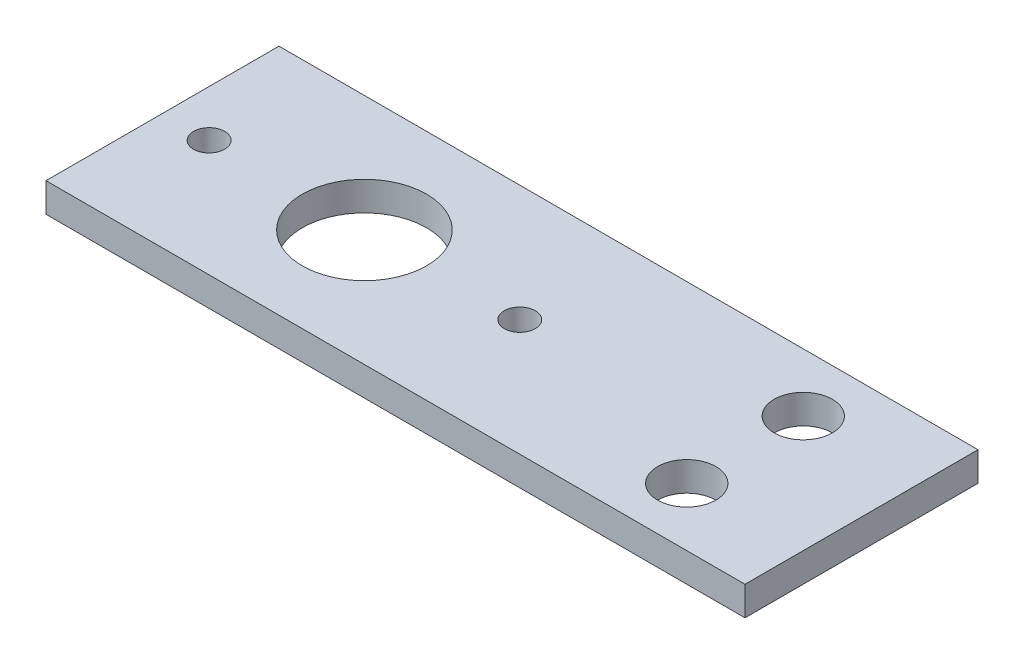
ISO-10303-21;
HEADER;
FILE_DESCRIPTION(('STEP AP214'),'2;1');
FILE_NAME('part.step','',(''),(''),'','','');
FILE_SCHEMA(('AUTOMOTIVE_DESIGN { 1 0 10303 214 1 1 1 1 }'));
ENDSEC;
DATA;
#1=APPLICATION_CONTEXT('core data for automotive mechanical design processes');
#2=APPLICATION_PROTOCOL_DEFINITION('international standard','automotive_design',2000,#1);
#3=PRODUCT_CONTEXT('',#1,'mechanical');
#4=PRODUCT('Part','Part','',(#3));
#5=PRODUCT_RELATED_PRODUCT_CATEGORY('part','',(#4));
#6=PRODUCT_DEFINITION_FORMATION('','',#4);
#7=PRODUCT_DEFINITION_CONTEXT('part definition',#1,'design');
#8=PRODUCT_DEFINITION('design','',#6,#7);
#9=PRODUCT_DEFINITION_SHAPE('','',#8);
#10=(LENGTH_UNIT() NAMED_UNIT(*) SI_UNIT(.MILLI.,.METRE.));
#11=(NAMED_UNIT(*) PLANE_ANGLE_UNIT() SI_UNIT($,.RADIAN.));
#12=(NAMED_UNIT(*) SI_UNIT($,.STERADIAN.) SOLID_ANGLE_UNIT());
#13=UNCERTAINTY_MEASURE_WITH_UNIT(LENGTH_MEASURE(1.E-05),#10,'distance_accuracy_value','');
#14=(GEOMETRIC_REPRESENTATION_CONTEXT(3) GLOBAL_UNCERTAINTY_ASSIGNED_CONTEXT((#13)) GLOBAL_UNIT_ASSIGNED_CONTEXT((#10,
#11,#12)) REPRESENTATION_CONTEXT('',''));
#15=CARTESIAN_POINT('',(0.,0.,0.));
#16=DIRECTION('',(0.,0.,1.));
#17=DIRECTION('',(1.,0.,0.));
#18=AXIS2_PLACEMENT_3D('',#15,#16,#17);
#19=CARTESIAN_POINT('',(0.,4.7625,0.));
#20=DIRECTION('',(0.,-1.,0.));
#21=DIRECTION('',(0.,0.,-1.));
#22=AXIS2_PLACEMENT_3D('',#19,#20,#21);
#23=PLANE('',#22);
#24=DIRECTION('',(0.,0.,1.));
#25=VECTOR('',#24,1.);
#26=CARTESIAN_POINT('',(-114.3,4.7625,19.05));
#27=LINE('',#26,#25);
#28=CARTESIAN_POINT('',(-114.3,4.7625,-19.05));
#29=VERTEX_POINT('',#28);
#30=CARTESIAN_POINT('',(-114.3,4.7625,19.05));
#31=VERTEX_POINT('',#30);
#32=EDGE_CURVE('E98',#29,#31,#27,.T.);
#33=ORIENTED_EDGE('',*,*,#32,.T.);
#34=DIRECTION('',(1.,0.,0.));
#35=VECTOR('',#34,1.);
#36=CARTESIAN_POINT('',(-114.3,4.7625,19.05));
#37=LINE('',#36,#35);
#38=CARTESIAN_POINT('',(0.,4.7625,19.05));
#39=VERTEX_POINT('',#38);
#40=EDGE_CURVE('E93',#31,#39,#37,.T.);
#41=ORIENTED_EDGE('',*,*,#40,.T.);
#42=DIRECTION('',(0.,0.,-1.));
#43=VECTOR('',#42,1.);
#44=CARTESIAN_POINT('',(0.,4.7625,-19.05));
#45=LINE('',#44,#43);
#46=CARTESIAN_POINT('',(0.,4.7625,-19.05));
#47=VERTEX_POINT('',#46);
#48=EDGE_CURVE('E96',#39,#47,#45,.T.);
#49=ORIENTED_EDGE('',*,*,#48,.T.);
#50=DIRECTION('',(-1.,0.,0.));
#51=VECTOR('',#50,1.);
#52=CARTESIAN_POINT('',(-114.3,4.7625,-19.05));
#53=LINE('',#52,#51);
#54=EDGE_CURVE('E63',#47,#29,#53,.T.);
#55=ORIENTED_EDGE('',*,*,#54,.T.);
#56=EDGE_LOOP('',(#33,#41,#49,#55));
#57=FACE_BOUND('',#56,.T.);
#58=CARTESIAN_POINT('',(-106.68,4.7625,0.));
#59=DIRECTION('',(0.,1.,0.));
#60=DIRECTION('',(0.,0.,1.));
#61=AXIS2_PLACEMENT_3D('',#58,#59,#60);
#62=CIRCLE('',#61,2.53999999999998);
#63=CARTESIAN_POINT('',(-106.68,4.7625,-2.53999999999998));
#64=VERTEX_POINT('',#63);
#65=EDGE_CURVE('E120',#64,#64,#62,.T.);
#66=ORIENTED_EDGE('',*,*,#65,.F.);
#67=EDGE_LOOP('',(#66));
#68=FACE_BOUND('',#67,.T.);
#69=CARTESIAN_POINT('',(-81.28,4.7625,0.));
#70=DIRECTION('',(0.,1.,0.));
#71=DIRECTION('',(0.,0.,1.));
#72=AXIS2_PLACEMENT_3D('',#69,#70,#71);
#73=CIRCLE('',#72,10.16);
#74=CARTESIAN_POINT('',(-81.28,4.7625,-10.16));
#75=VERTEX_POINT('',#74);
#76=EDGE_CURVE('E146',#75,#75,#73,.T.);
#77=ORIENTED_EDGE('',*,*,#76,.F.);
#78=EDGE_LOOP('',(#77));
#79=FACE_BOUND('',#78,.T.);
#80=CARTESIAN_POINT('',(-55.88,4.7625,0.));
#81=DIRECTION('',(0.,1.,0.));
#82=DIRECTION('',(0.,0.,1.));
#83=AXIS2_PLACEMENT_3D('',#80,#81,#82);
#84=CIRCLE('',#83,2.53999999999998);
#85=CARTESIAN_POINT('',(-55.88,4.7625,-2.53999999999998));
#86=VERTEX_POINT('',#85);
#87=EDGE_CURVE('E154',#86,#86,#84,.T.);
#88=ORIENTED_EDGE('',*,*,#87,.F.);
#89=EDGE_LOOP('',(#88));
#90=FACE_BOUND('',#89,.T.);
#91=CARTESIAN_POINT('',(-19.05,4.7625,-9.52499999999999));
#92=DIRECTION('',(0.,1.,0.));
#93=DIRECTION('',(0.,0.,1.));
#94=AXIS2_PLACEMENT_3D('',#91,#92,#93);
#95=CIRCLE('',#94,4.76250000000001);
#96=CARTESIAN_POINT('',(-19.05,4.7625,-14.2875));
#97=VERTEX_POINT('',#96);
#98=EDGE_CURVE('E162',#97,#97,#95,.T.);
#99=ORIENTED_EDGE('',*,*,#98,.F.);
#100=EDGE_LOOP('',(#99));
#101=FACE_BOUND('',#100,.T.);
#102=CARTESIAN_POINT('',(-19.05,4.7625,9.52500000000001));
#103=DIRECTION('',(0.,1.,0.));
#104=DIRECTION('',(0.,0.,-1.));
#105=AXIS2_PLACEMENT_3D('',#102,#103,#104);
#106=CIRCLE('',#105,4.76250000000001);
#107=CARTESIAN_POINT('',(-19.05,4.7625,4.7625));
#108=VERTEX_POINT('',#107);
#109=EDGE_CURVE('E170',#108,#108,#106,.T.);
#110=ORIENTED_EDGE('',*,*,#109,.F.);
#111=EDGE_LOOP('',(#110));
#112=FACE_BOUND('',#111,.T.);
#113=ADVANCED_FACE('F45',(#57,#68,#79,#90,#101,#112),#23,.F.);
#114=CARTESIAN_POINT('',(0.,0.,0.));
#115=DIRECTION('',(0.,-1.,0.));
#116=DIRECTION('',(0.,0.,-1.));
#117=AXIS2_PLACEMENT_3D('',#114,#115,#116);
#118=PLANE('',#117);
#119=CARTESIAN_POINT('',(-19.05,0.,-9.52499999999999));
#120=DIRECTION('',(0.,1.,0.));
#121=DIRECTION('',(0.,0.,1.));
#122=AXIS2_PLACEMENT_3D('',#119,#120,#121);
#123=CIRCLE('',#122,4.76250000000001);
#124=CARTESIAN_POINT('',(-19.05,0.,-14.2875));
#125=VERTEX_POINT('',#124);
#126=EDGE_CURVE('E166',#125,#125,#123,.T.);
#127=ORIENTED_EDGE('',*,*,#126,.T.);
#128=EDGE_LOOP('',(#127));
#129=FACE_BOUND('',#128,.T.);
#130=CARTESIAN_POINT('',(-81.28,0.,0.));
#131=DIRECTION('',(0.,1.,0.));
#132=DIRECTION('',(0.,0.,1.));
#133=AXIS2_PLACEMENT_3D('',#130,#131,#132);
#134=CIRCLE('',#133,10.16);
#135=CARTESIAN_POINT('',(-81.28,0.,-10.16));
#136=VERTEX_POINT('',#135);
#137=EDGE_CURVE('E150',#136,#136,#134,.T.);
#138=ORIENTED_EDGE('',*,*,#137,.T.);
#139=EDGE_LOOP('',(#138));
#140=FACE_BOUND('',#139,.T.);
#141=DIRECTION('',(0.,0.,1.));
#142=VECTOR('',#141,1.);
#143=CARTESIAN_POINT('',(-114.3,0.,19.05));
#144=LINE('',#143,#142);
#145=CARTESIAN_POINT('',(-114.3,0.,-19.05));
#146=VERTEX_POINT('',#145);
#147=CARTESIAN_POINT('',(-114.3,0.,19.05));
#148=VERTEX_POINT('',#147);
#149=EDGE_CURVE('E116',#146,#148,#144,.T.);
#150=ORIENTED_EDGE('',*,*,#149,.F.);
#151=DIRECTION('',(-1.,0.,0.));
#152=VECTOR('',#151,1.);
#153=CARTESIAN_POINT('',(-114.3,0.,-19.05));
#154=LINE('',#153,#152);
#155=CARTESIAN_POINT('',(0.,0.,-19.05));
#156=VERTEX_POINT('',#155);
#157=EDGE_CURVE('E86',#156,#146,#154,.T.);
#158=ORIENTED_EDGE('',*,*,#157,.F.);
#159=DIRECTION('',(0.,0.,-1.));
#160=VECTOR('',#159,1.);
#161=CARTESIAN_POINT('',(0.,0.,-19.05));
#162=LINE('',#161,#160);
#163=CARTESIAN_POINT('',(0.,0.,19.05));
#164=VERTEX_POINT('',#163);
#165=EDGE_CURVE('E80',#164,#156,#162,.T.);
#166=ORIENTED_EDGE('',*,*,#165,.F.);
#167=DIRECTION('',(1.,0.,0.));
#168=VECTOR('',#167,1.);
#169=CARTESIAN_POINT('',(-114.3,0.,19.05));
#170=LINE('',#169,#168);
#171=EDGE_CURVE('E103',#148,#164,#170,.T.);
#172=ORIENTED_EDGE('',*,*,#171,.F.);
#173=EDGE_LOOP('',(#150,#158,#166,#172));
#174=FACE_BOUND('',#173,.T.);
#175=CARTESIAN_POINT('',(-106.68,0.,0.));
#176=DIRECTION('',(0.,1.,0.));
#177=DIRECTION('',(0.,0.,1.));
#178=AXIS2_PLACEMENT_3D('',#175,#176,#177);
#179=CIRCLE('',#178,2.53999999999998);
#180=CARTESIAN_POINT('',(-106.68,0.,-2.53999999999998));
#181=VERTEX_POINT('',#180);
#182=EDGE_CURVE('E142',#181,#181,#179,.T.);
#183=ORIENTED_EDGE('',*,*,#182,.T.);
#184=EDGE_LOOP('',(#183));
#185=FACE_BOUND('',#184,.T.);
#186=CARTESIAN_POINT('',(-55.88,0.,0.));
#187=DIRECTION('',(0.,1.,0.));
#188=DIRECTION('',(0.,0.,1.));
#189=AXIS2_PLACEMENT_3D('',#186,#187,#188);
#190=CIRCLE('',#189,2.53999999999998);
#191=CARTESIAN_POINT('',(-55.88,0.,-2.53999999999998));
#192=VERTEX_POINT('',#191);
#193=EDGE_CURVE('E158',#192,#192,#190,.T.);
#194=ORIENTED_EDGE('',*,*,#193,.T.);
#195=EDGE_LOOP('',(#194));
#196=FACE_BOUND('',#195,.T.);
#197=CARTESIAN_POINT('',(-19.05,0.,9.52500000000001));
#198=DIRECTION('',(0.,1.,0.));
#199=DIRECTION('',(0.,0.,-1.));
#200=AXIS2_PLACEMENT_3D('',#197,#198,#199);
#201=CIRCLE('',#200,4.76250000000001);
#202=CARTESIAN_POINT('',(-19.05,0.,4.7625));
#203=VERTEX_POINT('',#202);
#204=EDGE_CURVE('E174',#203,#203,#201,.T.);
#205=ORIENTED_EDGE('',*,*,#204,.T.);
#206=EDGE_LOOP('',(#205));
#207=FACE_BOUND('',#206,.T.);
#208=ADVANCED_FACE('F135',(#129,#140,#174,#185,#196,#207),#118,.T.);
#209=CARTESIAN_POINT('',(-114.3,4.7625,19.05));
#210=DIRECTION('',(1.,0.,0.));
#211=DIRECTION('',(0.,0.,-1.));
#212=AXIS2_PLACEMENT_3D('',#209,#210,#211);
#213=PLANE('',#212);
#214=ORIENTED_EDGE('',*,*,#149,.T.);
#215=DIRECTION('',(0.,-1.,0.));
#216=VECTOR('',#215,1.);
#217=CARTESIAN_POINT('',(-114.3,4.7625,19.05));
#218=LINE('',#217,#216);
#219=EDGE_CURVE('E11',#31,#148,#218,.T.);
#220=ORIENTED_EDGE('',*,*,#219,.F.);
#221=ORIENTED_EDGE('',*,*,#32,.F.);
#222=DIRECTION('',(0.,-1.,0.));
#223=VECTOR('',#222,1.);
#224=CARTESIAN_POINT('',(-114.3,4.7625,-19.05));
#225=LINE('',#224,#223);
#226=EDGE_CURVE('E112',#29,#146,#225,.T.);
#227=ORIENTED_EDGE('',*,*,#226,.T.);
#228=EDGE_LOOP('',(#214,#220,#221,#227));
#229=FACE_BOUND('',#228,.T.);
#230=ADVANCED_FACE('F47',(#229),#213,.F.);
#231=CARTESIAN_POINT('',(-114.3,4.7625,19.05));
#232=DIRECTION('',(0.,0.,-1.));
#233=DIRECTION('',(-1.,0.,0.));
#234=AXIS2_PLACEMENT_3D('',#231,#232,#233);
#235=PLANE('',#234);
#236=ORIENTED_EDGE('',*,*,#171,.T.);
#237=DIRECTION('',(0.,-1.,0.));
#238=VECTOR('',#237,1.);
#239=CARTESIAN_POINT('',(0.,4.7625,19.05));
#240=LINE('',#239,#238);
#241=EDGE_CURVE('E55',#39,#164,#240,.T.);
#242=ORIENTED_EDGE('',*,*,#241,.F.);
#243=ORIENTED_EDGE('',*,*,#40,.F.);
#244=ORIENTED_EDGE('',*,*,#219,.T.);
#245=EDGE_LOOP('',(#236,#242,#243,#244));
#246=FACE_BOUND('',#245,.T.);
#247=ADVANCED_FACE('F102',(#246),#235,.F.);
#248=CARTESIAN_POINT('',(0.,4.7625,-19.05));
#249=DIRECTION('',(-1.,0.,0.));
#250=DIRECTION('',(0.,0.,1.));
#251=AXIS2_PLACEMENT_3D('',#248,#249,#250);
#252=PLANE('',#251);
#253=ORIENTED_EDGE('',*,*,#165,.T.);
#254=DIRECTION('',(0.,-1.,0.));
#255=VECTOR('',#254,1.);
#256=CARTESIAN_POINT('',(0.,4.7625,-19.05));
#257=LINE('',#256,#255);
#258=EDGE_CURVE('E105',#47,#156,#257,.T.);
#259=ORIENTED_EDGE('',*,*,#258,.F.);
#260=ORIENTED_EDGE('',*,*,#48,.F.);
#261=ORIENTED_EDGE('',*,*,#241,.T.);
#262=EDGE_LOOP('',(#253,#259,#260,#261));
#263=FACE_BOUND('',#262,.T.);
#264=ADVANCED_FACE('F106',(#263),#252,.F.);
#265=CARTESIAN_POINT('',(-114.3,4.7625,-19.05));
#266=DIRECTION('',(0.,0.,1.));
#267=DIRECTION('',(1.,0.,0.));
#268=AXIS2_PLACEMENT_3D('',#265,#266,#267);
#269=PLANE('',#268);
#270=ORIENTED_EDGE('',*,*,#157,.T.);
#271=ORIENTED_EDGE('',*,*,#226,.F.);
#272=ORIENTED_EDGE('',*,*,#54,.F.);
#273=ORIENTED_EDGE('',*,*,#258,.T.);
#274=EDGE_LOOP('',(#270,#271,#272,#273));
#275=FACE_BOUND('',#274,.T.);
#276=ADVANCED_FACE('F132',(#275),#269,.F.);
#277=CARTESIAN_POINT('',(-106.68,4.7625,0.));
#278=DIRECTION('',(0.,-1.,0.));
#279=DIRECTION('',(0.,0.,-1.));
#280=AXIS2_PLACEMENT_3D('',#277,#278,#279);
#281=CYLINDRICAL_SURFACE('',#280,2.53999999999998);
#282=CARTESIAN_POINT('',(-106.68,4.7625,-2.53999999999998));
#283=CARTESIAN_POINT('',(-106.68,4.712890625,-2.53999999999998));
#284=CARTESIAN_POINT('',(-106.68,4.66328125,-2.53999999999998));
#285=CARTESIAN_POINT('',(-106.68,4.5640625,-2.53999999999998));
#286=CARTESIAN_POINT('',(-106.68,4.514453125,-2.53999999999998));
#287=CARTESIAN_POINT('',(-106.68,4.415234375,-2.53999999999998));
#288=CARTESIAN_POINT('',(-106.68,4.365625,-2.53999999999998));
#289=CARTESIAN_POINT('',(-106.68,4.26640625,-2.53999999999998));
#290=CARTESIAN_POINT('',(-106.68,4.216796875,-2.53999999999998));
#291=CARTESIAN_POINT('',(-106.68,4.117578125,-2.53999999999998));
#292=CARTESIAN_POINT('',(-106.68,4.06796875,-2.53999999999998));
#293=CARTESIAN_POINT('',(-106.68,3.96875,-2.53999999999998));
#294=CARTESIAN_POINT('',(-106.68,3.919140625,-2.53999999999998));
#295=CARTESIAN_POINT('',(-106.68,3.819921875,-2.53999999999998));
#296=CARTESIAN_POINT('',(-106.68,3.7703125,-2.53999999999998));
#297=CARTESIAN_POINT('',(-106.68,3.67109375,-2.53999999999998));
#298=CARTESIAN_POINT('',(-106.68,3.621484375,-2.53999999999998));
#299=CARTESIAN_POINT('',(-106.68,3.522265625,-2.53999999999998));
#300=CARTESIAN_POINT('',(-106.68,3.47265625,-2.53999999999998));
#301=CARTESIAN_POINT('',(-106.68,3.3734375,-2.53999999999998));
#302=CARTESIAN_POINT('',(-106.68,3.323828125,-2.53999999999998));
#303=CARTESIAN_POINT('',(-106.68,3.224609375,-2.53999999999998));
#304=CARTESIAN_POINT('',(-106.68,3.175,-2.53999999999998));
#305=CARTESIAN_POINT('',(-106.68,3.07578125,-2.53999999999998));
#306=CARTESIAN_POINT('',(-106.68,3.026171875,-2.53999999999998));
#307=CARTESIAN_POINT('',(-106.68,2.926953125,-2.53999999999998));
#308=CARTESIAN_POINT('',(-106.68,2.87734375,-2.53999999999998));
#309=CARTESIAN_POINT('',(-106.68,2.778125,-2.53999999999998));
#310=CARTESIAN_POINT('',(-106.68,2.728515625,-2.53999999999998));
#311=CARTESIAN_POINT('',(-106.68,2.629296875,-2.53999999999998));
#312=CARTESIAN_POINT('',(-106.68,2.5796875,-2.53999999999998));
#313=CARTESIAN_POINT('',(-106.68,2.48046875,-2.53999999999998));
#314=CARTESIAN_POINT('',(-106.68,2.430859375,-2.53999999999998));
#315=CARTESIAN_POINT('',(-106.68,2.331640625,-2.53999999999998));
#316=CARTESIAN_POINT('',(-106.68,2.28203125,-2.53999999999998));
#317=CARTESIAN_POINT('',(-106.68,2.1828125,-2.53999999999998));
#318=CARTESIAN_POINT('',(-106.68,2.133203125,-2.53999999999998));
#319=CARTESIAN_POINT('',(-106.68,2.033984375,-2.53999999999998));
#320=CARTESIAN_POINT('',(-106.68,1.984375,-2.53999999999998));
#321=CARTESIAN_POINT('',(-106.68,1.88515625,-2.53999999999998));
#322=CARTESIAN_POINT('',(-106.68,1.835546875,-2.53999999999998));
#323=CARTESIAN_POINT('',(-106.68,1.736328125,-2.53999999999998));
#324=CARTESIAN_POINT('',(-106.68,1.68671875,-2.53999999999998));
#325=CARTESIAN_POINT('',(-106.68,1.5875,-2.53999999999998));
#326=CARTESIAN_POINT('',(-106.68,1.537890625,-2.53999999999998));
#327=CARTESIAN_POINT('',(-106.68,1.438671875,-2.53999999999998));
#328=CARTESIAN_POINT('',(-106.68,1.3890625,-2.53999999999998));
#329=CARTESIAN_POINT('',(-106.68,1.28984375,-2.53999999999998));
#330=CARTESIAN_POINT('',(-106.68,1.240234375,-2.53999999999998));
#331=CARTESIAN_POINT('',(-106.68,1.141015625,-2.53999999999998));
#332=CARTESIAN_POINT('',(-106.68,1.09140625,-2.53999999999998));
#333=CARTESIAN_POINT('',(-106.68,0.992187499999999,-2.53999999999998));
#334=CARTESIAN_POINT('',(-106.68,0.942578124999999,-2.53999999999998));
#335=CARTESIAN_POINT('',(-106.68,0.843359375,-2.53999999999998));
#336=CARTESIAN_POINT('',(-106.68,0.79375,-2.53999999999998));
#337=CARTESIAN_POINT('',(-106.68,0.69453125,-2.53999999999998));
#338=CARTESIAN_POINT('',(-106.68,0.644921875,-2.53999999999998));
#339=CARTESIAN_POINT('',(-106.68,0.545703125,-2.53999999999998));
#340=CARTESIAN_POINT('',(-106.68,0.49609375,-2.53999999999998));
#341=CARTESIAN_POINT('',(-106.68,0.396875,-2.53999999999998));
#342=CARTESIAN_POINT('',(-106.68,0.347265625,-2.53999999999998));
#343=CARTESIAN_POINT('',(-106.68,0.248046875,-2.53999999999998));
#344=CARTESIAN_POINT('',(-106.68,0.1984375,-2.53999999999998));
#345=CARTESIAN_POINT('',(-106.68,0.09921875,-2.53999999999998));
#346=CARTESIAN_POINT('',(-106.68,0.049609375,-2.53999999999998));
#347=CARTESIAN_POINT('',(-106.68,0.,-2.53999999999998));
#348=B_SPLINE_CURVE_WITH_KNOTS('',3,(#282,#283,#284,#285,#286,#287,#288,#289,#290,#291,#292,
#293,#294,#295,#296,#297,#298,#299,#300,#301,#302,#303,#304,#305,#306,#307,#308,#309,#310,#311,
#312,#313,#314,#315,#316,#317,#318,#319,#320,#321,#322,#323,#324,#325,#326,#327,#328,#329,#330,
#331,#332,#333,#334,#335,#336,#337,#338,#339,#340,#341,#342,#343,#344,#345,#346,#347),
.UNSPECIFIED.,.F.,.F.,(4,2,2,2,2,2,2,2,2,2,2,2,2,2,2,2,2,2,2,2,2,2,2,2,2,2,2,2,2,2,2,2,4),(0.,
0.148828125,0.29765625,0.446484375,0.5953125,0.744140625,0.892968750000001,1.041796875,1.190625,
1.339453125,1.48828125,1.637109375,1.7859375,1.934765625,2.08359375,2.232421875,2.38125,
2.530078125,2.67890625,2.827734375,2.9765625,3.125390625,3.27421875,3.423046875,3.571875,
3.720703125,3.86953125,4.018359375,4.1671875,4.316015625,4.46484375,4.613671875,4.7625),.UNSPECIFIED.);
#349=EDGE_CURVE('BSEAM195',#64,#181,#348,.T.);
#350=ORIENTED_EDGE('',*,*,#65,.T.);
#351=ORIENTED_EDGE('',*,*,#182,.F.);
#352=ORIENTED_EDGE('',*,*,#349,.T.);
#353=ORIENTED_EDGE('',*,*,#349,.F.);
#354=EDGE_LOOP('',(#350,#352,#351,#353));
#355=FACE_BOUND('',#354,.T.);
#356=ADVANCED_FACE('F195',(#355),#281,.F.);
#357=CARTESIAN_POINT('',(-81.28,4.7625,0.));
#358=DIRECTION('',(0.,-1.,0.));
#359=DIRECTION('',(0.,0.,-1.));
#360=AXIS2_PLACEMENT_3D('',#357,#358,#359);
#361=CYLINDRICAL_SURFACE('',#360,10.16);
#362=CARTESIAN_POINT('',(-81.28,4.7625,-10.16));
#363=CARTESIAN_POINT('',(-81.28,4.712890625,-10.16));
#364=CARTESIAN_POINT('',(-81.28,4.66328125,-10.16));
#365=CARTESIAN_POINT('',(-81.28,4.5640625,-10.16));
#366=CARTESIAN_POINT('',(-81.28,4.514453125,-10.16));
#367=CARTESIAN_POINT('',(-81.28,4.415234375,-10.16));
#368=CARTESIAN_POINT('',(-81.28,4.365625,-10.16));
#369=CARTESIAN_POINT('',(-81.28,4.26640625,-10.16));
#370=CARTESIAN_POINT('',(-81.28,4.216796875,-10.16));
#371=CARTESIAN_POINT('',(-81.28,4.117578125,-10.16));
#372=CARTESIAN_POINT('',(-81.28,4.06796875,-10.16));
#373=CARTESIAN_POINT('',(-81.28,3.96875,-10.16));
#374=CARTESIAN_POINT('',(-81.28,3.919140625,-10.16));
#375=CARTESIAN_POINT('',(-81.28,3.819921875,-10.16));
#376=CARTESIAN_POINT('',(-81.28,3.7703125,-10.16));
#377=CARTESIAN_POINT('',(-81.28,3.67109375,-10.16));
#378=CARTESIAN_POINT('',(-81.28,3.621484375,-10.16));
#379=CARTESIAN_POINT('',(-81.28,3.522265625,-10.16));
#380=CARTESIAN_POINT('',(-81.28,3.47265625,-10.16));
#381=CARTESIAN_POINT('',(-81.28,3.3734375,-10.16));
#382=CARTESIAN_POINT('',(-81.28,3.323828125,-10.16));
#383=CARTESIAN_POINT('',(-81.28,3.224609375,-10.16));
#384=CARTESIAN_POINT('',(-81.28,3.175,-10.16));
#385=CARTESIAN_POINT('',(-81.28,3.07578125,-10.16));
#386=CARTESIAN_POINT('',(-81.28,3.026171875,-10.16));
#387=CARTESIAN_POINT('',(-81.28,2.926953125,-10.16));
#388=CARTESIAN_POINT('',(-81.28,2.87734375,-10.16));
#389=CARTESIAN_POINT('',(-81.28,2.778125,-10.16));
#390=CARTESIAN_POINT('',(-81.28,2.728515625,-10.16));
#391=CARTESIAN_POINT('',(-81.28,2.629296875,-10.16));
#392=CARTESIAN_POINT('',(-81.28,2.5796875,-10.16));
#393=CARTESIAN_POINT('',(-81.28,2.48046875,-10.16));
#394=CARTESIAN_POINT('',(-81.28,2.430859375,-10.16));
#395=CARTESIAN_POINT('',(-81.28,2.331640625,-10.16));
#396=CARTESIAN_POINT('',(-81.28,2.28203125,-10.16));
#397=CARTESIAN_POINT('',(-81.28,2.1828125,-10.16));
#398=CARTESIAN_POINT('',(-81.28,2.133203125,-10.16));
#399=CARTESIAN_POINT('',(-81.28,2.033984375,-10.16));
#400=CARTESIAN_POINT('',(-81.28,1.984375,-10.16));
#401=CARTESIAN_POINT('',(-81.28,1.88515625,-10.16));
#402=CARTESIAN_POINT('',(-81.28,1.835546875,-10.16));
#403=CARTESIAN_POINT('',(-81.28,1.736328125,-10.16));
#404=CARTESIAN_POINT('',(-81.28,1.68671875,-10.16));
#405=CARTESIAN_POINT('',(-81.28,1.5875,-10.16));
#406=CARTESIAN_POINT('',(-81.28,1.537890625,-10.16));
#407=CARTESIAN_POINT('',(-81.28,1.438671875,-10.16));
#408=CARTESIAN_POINT('',(-81.28,1.3890625,-10.16));
#409=CARTESIAN_POINT('',(-81.28,1.28984375,-10.16));
#410=CARTESIAN_POINT('',(-81.28,1.240234375,-10.16));
#411=CARTESIAN_POINT('',(-81.28,1.141015625,-10.16));
#412=CARTESIAN_POINT('',(-81.28,1.09140625,-10.16));
#413=CARTESIAN_POINT('',(-81.28,0.9921875,-10.16));
#414=CARTESIAN_POINT('',(-81.28,0.942578125,-10.16));
#415=CARTESIAN_POINT('',(-81.28,0.843359375,-10.16));
#416=CARTESIAN_POINT('',(-81.28,0.79375,-10.16));
#417=CARTESIAN_POINT('',(-81.28,0.69453125,-10.16));
#418=CARTESIAN_POINT('',(-81.28,0.644921875,-10.16));
#419=CARTESIAN_POINT('',(-81.28,0.545703125,-10.16));
#420=CARTESIAN_POINT('',(-81.28,0.49609375,-10.16));
#421=CARTESIAN_POINT('',(-81.28,0.396875,-10.16));
#422=CARTESIAN_POINT('',(-81.28,0.347265625,-10.16));
#423=CARTESIAN_POINT('',(-81.28,0.248046875,-10.16));
#424=CARTESIAN_POINT('',(-81.28,0.1984375,-10.16));
#425=CARTESIAN_POINT('',(-81.28,0.09921875,-10.16));
#426=CARTESIAN_POINT('',(-81.28,0.049609375,-10.16));
#427=CARTESIAN_POINT('',(-81.28,0.,-10.16));
#428=B_SPLINE_CURVE_WITH_KNOTS('',3,(#362,#363,#364,#365,#366,#367,#368,#369,#370,#371,#372,
#373,#374,#375,#376,#377,#378,#379,#380,#381,#382,#383,#384,#385,#386,#387,#388,#389,#390,#391,
#392,#393,#394,#395,#396,#397,#398,#399,#400,#401,#402,#403,#404,#405,#406,#407,#408,#409,#410,
#411,#412,#413,#414,#415,#416,#417,#418,#419,#420,#421,#422,#423,#424,#425,#426,#427),
.UNSPECIFIED.,.F.,.F.,(4,2,2,2,2,2,2,2,2,2,2,2,2,2,2,2,2,2,2,2,2,2,2,2,2,2,2,2,2,2,2,2,4),(0.,
0.148828124999999,0.297656249999999,0.446484374999999,0.595312499999999,0.744140625,0.89296875,
1.041796875,1.190625,1.339453125,1.48828125,1.637109375,1.7859375,1.934765625,2.08359375,
2.232421875,2.38125,2.530078125,2.67890625,2.827734375,2.9765625,3.125390625,3.27421875,
3.423046875,3.571875,3.720703125,3.86953125,4.018359375,4.1671875,4.316015625,4.46484375,
4.613671875,4.7625),.UNSPECIFIED.);
#429=EDGE_CURVE('BSEAM249',#75,#136,#428,.T.);
#430=ORIENTED_EDGE('',*,*,#76,.T.);
#431=ORIENTED_EDGE('',*,*,#137,.F.);
#432=ORIENTED_EDGE('',*,*,#429,.T.);
#433=ORIENTED_EDGE('',*,*,#429,.F.);
#434=EDGE_LOOP('',(#430,#432,#431,#433));
#435=FACE_BOUND('',#434,.T.);
#436=ADVANCED_FACE('F249',(#435),#361,.F.);
#437=CARTESIAN_POINT('',(-55.88,4.7625,0.));
#438=DIRECTION('',(0.,-1.,0.));
#439=DIRECTION('',(0.,0.,-1.));
#440=AXIS2_PLACEMENT_3D('',#437,#438,#439);
#441=CYLINDRICAL_SURFACE('',#440,2.53999999999998);
#442=CARTESIAN_POINT('',(-55.88,4.7625,-2.53999999999998));
#443=CARTESIAN_POINT('',(-55.88,4.712890625,-2.53999999999998));
#444=CARTESIAN_POINT('',(-55.88,4.66328125,-2.53999999999998));
#445=CARTESIAN_POINT('',(-55.88,4.5640625,-2.53999999999998));
#446=CARTESIAN_POINT('',(-55.88,4.514453125,-2.53999999999998));
#447=CARTESIAN_POINT('',(-55.88,4.415234375,-2.53999999999998));
#448=CARTESIAN_POINT('',(-55.88,4.365625,-2.53999999999998));
#449=CARTESIAN_POINT('',(-55.88,4.26640625,-2.53999999999998));
#450=CARTESIAN_POINT('',(-55.88,4.216796875,-2.53999999999998));
#451=CARTESIAN_POINT('',(-55.88,4.117578125,-2.53999999999998));
#452=CARTESIAN_POINT('',(-55.88,4.06796875,-2.53999999999998));
#453=CARTESIAN_POINT('',(-55.88,3.96875,-2.53999999999998));
#454=CARTESIAN_POINT('',(-55.88,3.919140625,-2.53999999999998));
#455=CARTESIAN_POINT('',(-55.88,3.819921875,-2.53999999999998));
#456=CARTESIAN_POINT('',(-55.88,3.7703125,-2.53999999999998));
#457=CARTESIAN_POINT('',(-55.88,3.67109375,-2.53999999999998));
#458=CARTESIAN_POINT('',(-55.88,3.621484375,-2.53999999999998));
#459=CARTESIAN_POINT('',(-55.88,3.522265625,-2.53999999999998));
#460=CARTESIAN_POINT('',(-55.88,3.47265625,-2.53999999999998));
#461=CARTESIAN_POINT('',(-55.88,3.3734375,-2.53999999999998));
#462=CARTESIAN_POINT('',(-55.88,3.323828125,-2.53999999999998));
#463=CARTESIAN_POINT('',(-55.88,3.224609375,-2.53999999999998));
#464=CARTESIAN_POINT('',(-55.88,3.175,-2.53999999999998));
#465=CARTESIAN_POINT('',(-55.88,3.07578125,-2.53999999999998));
#466=CARTESIAN_POINT('',(-55.88,3.026171875,-2.53999999999998));
#467=CARTESIAN_POINT('',(-55.88,2.926953125,-2.53999999999998));
#468=CARTESIAN_POINT('',(-55.88,2.87734375,-2.53999999999998));
#469=CARTESIAN_POINT('',(-55.88,2.778125,-2.53999999999998));
#470=CARTESIAN_POINT('',(-55.88,2.728515625,-2.53999999999998));
#471=CARTESIAN_POINT('',(-55.88,2.629296875,-2.53999999999998));
#472=CARTESIAN_POINT('',(-55.88,2.5796875,-2.53999999999998));
#473=CARTESIAN_POINT('',(-55.88,2.48046875,-2.53999999999998));
#474=CARTESIAN_POINT('',(-55.88,2.430859375,-2.53999999999998));
#475=CARTESIAN_POINT('',(-55.88,2.331640625,-2.53999999999998));
#476=CARTESIAN_POINT('',(-55.88,2.28203125,-2.53999999999998));
#477=CARTESIAN_POINT('',(-55.88,2.1828125,-2.53999999999998));
#478=CARTESIAN_POINT('',(-55.88,2.133203125,-2.53999999999998));
#479=CARTESIAN_POINT('',(-55.88,2.033984375,-2.53999999999998));
#480=CARTESIAN_POINT('',(-55.88,1.984375,-2.53999999999998));
#481=CARTESIAN_POINT('',(-55.88,1.88515625,-2.53999999999998));
#482=CARTESIAN_POINT('',(-55.88,1.835546875,-2.53999999999998));
#483=CARTESIAN_POINT('',(-55.88,1.736328125,-2.53999999999998));
#484=CARTESIAN_POINT('',(-55.88,1.68671875,-2.53999999999998));
#485=CARTESIAN_POINT('',(-55.88,1.5875,-2.53999999999998));
#486=CARTESIAN_POINT('',(-55.88,1.537890625,-2.53999999999998));
#487=CARTESIAN_POINT('',(-55.88,1.438671875,-2.53999999999998));
#488=CARTESIAN_POINT('',(-55.88,1.3890625,-2.53999999999998));
#489=CARTESIAN_POINT('',(-55.88,1.28984375,-2.53999999999998));
#490=CARTESIAN_POINT('',(-55.88,1.240234375,-2.53999999999998));
#491=CARTESIAN_POINT('',(-55.88,1.141015625,-2.53999999999998));
#492=CARTESIAN_POINT('',(-55.88,1.09140625,-2.53999999999998));
#493=CARTESIAN_POINT('',(-55.88,0.992187499999999,-2.53999999999998));
#494=CARTESIAN_POINT('',(-55.88,0.942578124999999,-2.53999999999998));
#495=CARTESIAN_POINT('',(-55.88,0.843359375,-2.53999999999998));
#496=CARTESIAN_POINT('',(-55.88,0.79375,-2.53999999999998));
#497=CARTESIAN_POINT('',(-55.88,0.69453125,-2.53999999999998));
#498=CARTESIAN_POINT('',(-55.88,0.644921875,-2.53999999999998));
#499=CARTESIAN_POINT('',(-55.88,0.545703125,-2.53999999999998));
#500=CARTESIAN_POINT('',(-55.88,0.49609375,-2.53999999999998));
#501=CARTESIAN_POINT('',(-55.88,0.396875,-2.53999999999998));
#502=CARTESIAN_POINT('',(-55.88,0.347265625,-2.53999999999998));
#503=CARTESIAN_POINT('',(-55.88,0.248046875,-2.53999999999998));
#504=CARTESIAN_POINT('',(-55.88,0.1984375,-2.53999999999998));
#505=CARTESIAN_POINT('',(-55.88,0.09921875,-2.53999999999998));
#506=CARTESIAN_POINT('',(-55.88,0.049609375,-2.53999999999998));
#507=CARTESIAN_POINT('',(-55.88,0.,-2.53999999999998));
#508=B_SPLINE_CURVE_WITH_KNOTS('',3,(#442,#443,#444,#445,#446,#447,#448,#449,#450,#451,#452,
#453,#454,#455,#456,#457,#458,#459,#460,#461,#462,#463,#464,#465,#466,#467,#468,#469,#470,#471,
#472,#473,#474,#475,#476,#477,#478,#479,#480,#481,#482,#483,#484,#485,#486,#487,#488,#489,#490,
#491,#492,#493,#494,#495,#496,#497,#498,#499,#500,#501,#502,#503,#504,#505,#506,#507),
.UNSPECIFIED.,.F.,.F.,(4,2,2,2,2,2,2,2,2,2,2,2,2,2,2,2,2,2,2,2,2,2,2,2,2,2,2,2,2,2,2,2,4),(0.,
0.148828125,0.29765625,0.446484375,0.5953125,0.744140625,0.892968750000001,1.041796875,1.190625,
1.339453125,1.48828125,1.637109375,1.7859375,1.934765625,2.08359375,2.232421875,2.38125,
2.530078125,2.67890625,2.827734375,2.9765625,3.125390625,3.27421875,3.423046875,3.571875,
3.720703125,3.86953125,4.018359375,4.1671875,4.316015625,4.46484375,4.613671875,4.7625),.UNSPECIFIED.);
#509=EDGE_CURVE('BSEAM258',#86,#192,#508,.T.);
#510=ORIENTED_EDGE('',*,*,#87,.T.);
#511=ORIENTED_EDGE('',*,*,#193,.F.);
#512=ORIENTED_EDGE('',*,*,#509,.T.);
#513=ORIENTED_EDGE('',*,*,#509,.F.);
#514=EDGE_LOOP('',(#510,#512,#511,#513));
#515=FACE_BOUND('',#514,.T.);
#516=ADVANCED_FACE('F258',(#515),#441,.F.);
#517=CARTESIAN_POINT('',(-19.05,4.7625,-9.52499999999999));
#518=DIRECTION('',(0.,-1.,0.));
#519=DIRECTION('',(0.,0.,-1.));
#520=AXIS2_PLACEMENT_3D('',#517,#518,#519);
#521=CYLINDRICAL_SURFACE('',#520,4.76250000000001);
#522=CARTESIAN_POINT('',(-19.05,4.7625,-14.2875));
#523=CARTESIAN_POINT('',(-19.05,4.712890625,-14.2875));
#524=CARTESIAN_POINT('',(-19.05,4.66328125,-14.2875));
#525=CARTESIAN_POINT('',(-19.05,4.5640625,-14.2875));
#526=CARTESIAN_POINT('',(-19.05,4.514453125,-14.2875));
#527=CARTESIAN_POINT('',(-19.05,4.415234375,-14.2875));
#528=CARTESIAN_POINT('',(-19.05,4.365625,-14.2875));
#529=CARTESIAN_POINT('',(-19.05,4.26640625,-14.2875));
#530=CARTESIAN_POINT('',(-19.05,4.216796875,-14.2875));
#531=CARTESIAN_POINT('',(-19.05,4.117578125,-14.2875));
#532=CARTESIAN_POINT('',(-19.05,4.06796875,-14.2875));
#533=CARTESIAN_POINT('',(-19.05,3.96875,-14.2875));
#534=CARTESIAN_POINT('',(-19.05,3.919140625,-14.2875));
#535=CARTESIAN_POINT('',(-19.05,3.819921875,-14.2875));
#536=CARTESIAN_POINT('',(-19.05,3.7703125,-14.2875));
#537=CARTESIAN_POINT('',(-19.05,3.67109375,-14.2875));
#538=CARTESIAN_POINT('',(-19.05,3.621484375,-14.2875));
#539=CARTESIAN_POINT('',(-19.05,3.522265625,-14.2875));
#540=CARTESIAN_POINT('',(-19.05,3.47265625,-14.2875));
#541=CARTESIAN_POINT('',(-19.05,3.3734375,-14.2875));
#542=CARTESIAN_POINT('',(-19.05,3.323828125,-14.2875));
#543=CARTESIAN_POINT('',(-19.05,3.224609375,-14.2875));
#544=CARTESIAN_POINT('',(-19.05,3.175,-14.2875));
#545=CARTESIAN_POINT('',(-19.05,3.07578125,-14.2875));
#546=CARTESIAN_POINT('',(-19.05,3.026171875,-14.2875));
#547=CARTESIAN_POINT('',(-19.05,2.926953125,-14.2875));
#548=CARTESIAN_POINT('',(-19.05,2.87734375,-14.2875));
#549=CARTESIAN_POINT('',(-19.05,2.778125,-14.2875));
#550=CARTESIAN_POINT('',(-19.05,2.728515625,-14.2875));
#551=CARTESIAN_POINT('',(-19.05,2.629296875,-14.2875));
#552=CARTESIAN_POINT('',(-19.05,2.5796875,-14.2875));
#553=CARTESIAN_POINT('',(-19.05,2.48046875,-14.2875));
#554=CARTESIAN_POINT('',(-19.05,2.430859375,-14.2875));
#555=CARTESIAN_POINT('',(-19.05,2.331640625,-14.2875));
#556=CARTESIAN_POINT('',(-19.05,2.28203125,-14.2875));
#557=CARTESIAN_POINT('',(-19.05,2.1828125,-14.2875));
#558=CARTESIAN_POINT('',(-19.05,2.133203125,-14.2875));
#559=CARTESIAN_POINT('',(-19.05,2.033984375,-14.2875));
#560=CARTESIAN_POINT('',(-19.05,1.984375,-14.2875));
#561=CARTESIAN_POINT('',(-19.05,1.88515625,-14.2875));
#562=CARTESIAN_POINT('',(-19.05,1.835546875,-14.2875));
#563=CARTESIAN_POINT('',(-19.05,1.736328125,-14.2875));
#564=CARTESIAN_POINT('',(-19.05,1.68671875,-14.2875));
#565=CARTESIAN_POINT('',(-19.05,1.5875,-14.2875));
#566=CARTESIAN_POINT('',(-19.05,1.537890625,-14.2875));
#567=CARTESIAN_POINT('',(-19.05,1.438671875,-14.2875));
#568=CARTESIAN_POINT('',(-19.05,1.3890625,-14.2875));
#569=CARTESIAN_POINT('',(-19.05,1.28984375,-14.2875));
#570=CARTESIAN_POINT('',(-19.05,1.240234375,-14.2875));
#571=CARTESIAN_POINT('',(-19.05,1.141015625,-14.2875));
#572=CARTESIAN_POINT('',(-19.05,1.09140625,-14.2875));
#573=CARTESIAN_POINT('',(-19.05,0.992187499999999,-14.2875));
#574=CARTESIAN_POINT('',(-19.05,0.942578124999999,-14.2875));
#575=CARTESIAN_POINT('',(-19.05,0.843359375,-14.2875));
#576=CARTESIAN_POINT('',(-19.05,0.79375,-14.2875));
#577=CARTESIAN_POINT('',(-19.05,0.69453125,-14.2875));
#578=CARTESIAN_POINT('',(-19.05,0.644921875,-14.2875));
#579=CARTESIAN_POINT('',(-19.05,0.545703125,-14.2875));
#580=CARTESIAN_POINT('',(-19.05,0.49609375,-14.2875));
#581=CARTESIAN_POINT('',(-19.05,0.396875,-14.2875));
#582=CARTESIAN_POINT('',(-19.05,0.347265625,-14.2875));
#583=CARTESIAN_POINT('',(-19.05,0.248046875,-14.2875));
#584=CARTESIAN_POINT('',(-19.05,0.1984375,-14.2875));
#585=CARTESIAN_POINT('',(-19.05,0.09921875,-14.2875));
#586=CARTESIAN_POINT('',(-19.05,0.049609375,-14.2875));
#587=CARTESIAN_POINT('',(-19.05,0.,-14.2875));
#588=B_SPLINE_CURVE_WITH_KNOTS('',3,(#522,#523,#524,#525,#526,#527,#528,#529,#530,#531,#532,
#533,#534,#535,#536,#537,#538,#539,#540,#541,#542,#543,#544,#545,#546,#547,#548,#549,#550,#551,
#552,#553,#554,#555,#556,#557,#558,#559,#560,#561,#562,#563,#564,#565,#566,#567,#568,#569,#570,
#571,#572,#573,#574,#575,#576,#577,#578,#579,#580,#581,#582,#583,#584,#585,#586,#587),
.UNSPECIFIED.,.F.,.F.,(4,2,2,2,2,2,2,2,2,2,2,2,2,2,2,2,2,2,2,2,2,2,2,2,2,2,2,2,2,2,2,2,4),(0.,
0.148828125,0.29765625,0.446484375,0.5953125,0.744140625,0.892968750000001,1.041796875,1.190625,
1.339453125,1.48828125,1.637109375,1.7859375,1.934765625,2.08359375,2.232421875,2.38125,
2.530078125,2.67890625,2.827734375,2.9765625,3.125390625,3.27421875,3.423046875,3.571875,
3.720703125,3.86953125,4.018359375,4.1671875,4.316015625,4.46484375,4.613671875,4.7625),.UNSPECIFIED.);
#589=EDGE_CURVE('BSEAM267',#97,#125,#588,.T.);
#590=ORIENTED_EDGE('',*,*,#98,.T.);
#591=ORIENTED_EDGE('',*,*,#126,.F.);
#592=ORIENTED_EDGE('',*,*,#589,.T.);
#593=ORIENTED_EDGE('',*,*,#589,.F.);
#594=EDGE_LOOP('',(#590,#592,#591,#593));
#595=FACE_BOUND('',#594,.T.);
#596=ADVANCED_FACE('F267',(#595),#521,.F.);
#597=CARTESIAN_POINT('',(-19.05,4.7625,9.52500000000001));
#598=DIRECTION('',(0.,-1.,0.));
#599=DIRECTION('',(0.,0.,-1.));
#600=AXIS2_PLACEMENT_3D('',#597,#598,#599);
#601=CYLINDRICAL_SURFACE('',#600,4.76250000000001);
#602=CARTESIAN_POINT('',(-19.05,4.7625,4.7625));
#603=CARTESIAN_POINT('',(-19.05,4.712890625,4.7625));
#604=CARTESIAN_POINT('',(-19.05,4.66328125,4.7625));
#605=CARTESIAN_POINT('',(-19.05,4.5640625,4.7625));
#606=CARTESIAN_POINT('',(-19.05,4.514453125,4.7625));
#607=CARTESIAN_POINT('',(-19.05,4.415234375,4.7625));
#608=CARTESIAN_POINT('',(-19.05,4.365625,4.7625));
#609=CARTESIAN_POINT('',(-19.05,4.26640625,4.7625));
#610=CARTESIAN_POINT('',(-19.05,4.216796875,4.7625));
#611=CARTESIAN_POINT('',(-19.05,4.117578125,4.7625));
#612=CARTESIAN_POINT('',(-19.05,4.06796875,4.7625));
#613=CARTESIAN_POINT('',(-19.05,3.96875,4.7625));
#614=CARTESIAN_POINT('',(-19.05,3.919140625,4.7625));
#615=CARTESIAN_POINT('',(-19.05,3.819921875,4.7625));
#616=CARTESIAN_POINT('',(-19.05,3.7703125,4.7625));
#617=CARTESIAN_POINT('',(-19.05,3.67109375,4.7625));
#618=CARTESIAN_POINT('',(-19.05,3.621484375,4.7625));
#619=CARTESIAN_POINT('',(-19.05,3.522265625,4.7625));
#620=CARTESIAN_POINT('',(-19.05,3.47265625,4.7625));
#621=CARTESIAN_POINT('',(-19.05,3.3734375,4.7625));
#622=CARTESIAN_POINT('',(-19.05,3.323828125,4.7625));
#623=CARTESIAN_POINT('',(-19.05,3.224609375,4.7625));
#624=CARTESIAN_POINT('',(-19.05,3.175,4.7625));
#625=CARTESIAN_POINT('',(-19.05,3.07578125,4.7625));
#626=CARTESIAN_POINT('',(-19.05,3.026171875,4.7625));
#627=CARTESIAN_POINT('',(-19.05,2.926953125,4.7625));
#628=CARTESIAN_POINT('',(-19.05,2.87734375,4.7625));
#629=CARTESIAN_POINT('',(-19.05,2.778125,4.7625));
#630=CARTESIAN_POINT('',(-19.05,2.728515625,4.7625));
#631=CARTESIAN_POINT('',(-19.05,2.629296875,4.7625));
#632=CARTESIAN_POINT('',(-19.05,2.5796875,4.7625));
#633=CARTESIAN_POINT('',(-19.05,2.48046875,4.7625));
#634=CARTESIAN_POINT('',(-19.05,2.430859375,4.7625));
#635=CARTESIAN_POINT('',(-19.05,2.331640625,4.7625));
#636=CARTESIAN_POINT('',(-19.05,2.28203125,4.7625));
#637=CARTESIAN_POINT('',(-19.05,2.1828125,4.7625));
#638=CARTESIAN_POINT('',(-19.05,2.133203125,4.7625));
#639=CARTESIAN_POINT('',(-19.05,2.033984375,4.7625));
#640=CARTESIAN_POINT('',(-19.05,1.984375,4.7625));
#641=CARTESIAN_POINT('',(-19.05,1.88515625,4.7625));
#642=CARTESIAN_POINT('',(-19.05,1.835546875,4.7625));
#643=CARTESIAN_POINT('',(-19.05,1.736328125,4.7625));
#644=CARTESIAN_POINT('',(-19.05,1.68671875,4.7625));
#645=CARTESIAN_POINT('',(-19.05,1.5875,4.7625));
#646=CARTESIAN_POINT('',(-19.05,1.537890625,4.7625));
#647=CARTESIAN_POINT('',(-19.05,1.438671875,4.7625));
#648=CARTESIAN_POINT('',(-19.05,1.3890625,4.7625));
#649=CARTESIAN_POINT('',(-19.05,1.28984375,4.7625));
#650=CARTESIAN_POINT('',(-19.05,1.240234375,4.7625));
#651=CARTESIAN_POINT('',(-19.05,1.141015625,4.7625));
#652=CARTESIAN_POINT('',(-19.05,1.09140625,4.7625));
#653=CARTESIAN_POINT('',(-19.05,0.992187499999999,4.7625));
#654=CARTESIAN_POINT('',(-19.05,0.942578124999999,4.7625));
#655=CARTESIAN_POINT('',(-19.05,0.843359375,4.7625));
#656=CARTESIAN_POINT('',(-19.05,0.79375,4.7625));
#657=CARTESIAN_POINT('',(-19.05,0.69453125,4.7625));
#658=CARTESIAN_POINT('',(-19.05,0.644921875,4.7625));
#659=CARTESIAN_POINT('',(-19.05,0.545703125,4.7625));
#660=CARTESIAN_POINT('',(-19.05,0.49609375,4.7625));
#661=CARTESIAN_POINT('',(-19.05,0.396875,4.7625));
#662=CARTESIAN_POINT('',(-19.05,0.347265625,4.7625));
#663=CARTESIAN_POINT('',(-19.05,0.248046875,4.7625));
#664=CARTESIAN_POINT('',(-19.05,0.1984375,4.7625));
#665=CARTESIAN_POINT('',(-19.05,0.09921875,4.7625));
#666=CARTESIAN_POINT('',(-19.05,0.049609375,4.7625));
#667=CARTESIAN_POINT('',(-19.05,0.,4.7625));
#668=B_SPLINE_CURVE_WITH_KNOTS('',3,(#602,#603,#604,#605,#606,#607,#608,#609,#610,#611,#612,
#613,#614,#615,#616,#617,#618,#619,#620,#621,#622,#623,#624,#625,#626,#627,#628,#629,#630,#631,
#632,#633,#634,#635,#636,#637,#638,#639,#640,#641,#642,#643,#644,#645,#646,#647,#648,#649,#650,
#651,#652,#653,#654,#655,#656,#657,#658,#659,#660,#661,#662,#663,#664,#665,#666,#667),
.UNSPECIFIED.,.F.,.F.,(4,2,2,2,2,2,2,2,2,2,2,2,2,2,2,2,2,2,2,2,2,2,2,2,2,2,2,2,2,2,2,2,4),(0.,
0.148828125,0.29765625,0.446484375,0.5953125,0.744140625,0.892968750000001,1.041796875,1.190625,
1.339453125,1.48828125,1.637109375,1.7859375,1.934765625,2.08359375,2.232421875,2.38125,
2.530078125,2.67890625,2.827734375,2.9765625,3.125390625,3.27421875,3.423046875,3.571875,
3.720703125,3.86953125,4.018359375,4.1671875,4.316015625,4.46484375,4.613671875,4.7625),.UNSPECIFIED.);
#669=EDGE_CURVE('BSEAM184',#108,#203,#668,.T.);
#670=ORIENTED_EDGE('',*,*,#109,.T.);
#671=ORIENTED_EDGE('',*,*,#204,.F.);
#672=ORIENTED_EDGE('',*,*,#669,.T.);
#673=ORIENTED_EDGE('',*,*,#669,.F.);
#674=EDGE_LOOP('',(#670,#672,#671,#673));
#675=FACE_BOUND('',#674,.T.);
#676=ADVANCED_FACE('F184',(#675),#601,.F.);
#677=CLOSED_SHELL('',(#113,#208,#230,#247,#264,#276,#356,#436,#516,#596,#676));
#678=MANIFOLD_SOLID_BREP('B2',#677);
#679=ADVANCED_BREP_SHAPE_REPRESENTATION('',(#18,#678),#14);
#680=SHAPE_DEFINITION_REPRESENTATION(#9,#679);
ENDSEC;
END-ISO-10303-21;
